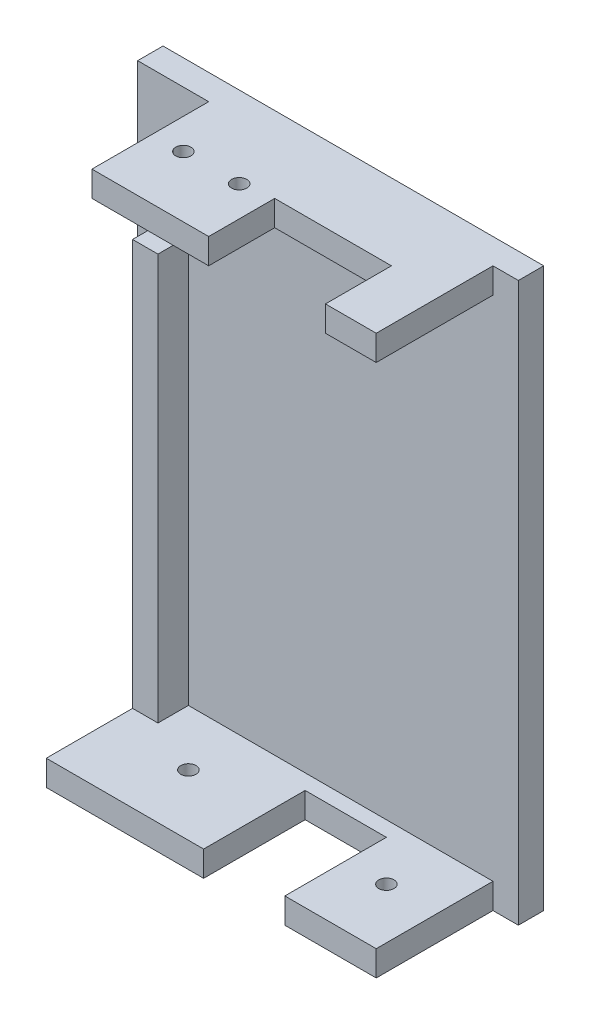
ISO-10303-21;
HEADER;
FILE_DESCRIPTION(('STEP AP214'),'2;1');
FILE_NAME('part.step','',(''),(''),'','','');
FILE_SCHEMA(('AUTOMOTIVE_DESIGN { 1 0 10303 214 1 1 1 1 }'));
ENDSEC;
DATA;
#1=APPLICATION_CONTEXT('core data for automotive mechanical design processes');
#2=APPLICATION_PROTOCOL_DEFINITION('international standard','automotive_design',2000,#1);
#3=PRODUCT_CONTEXT('',#1,'mechanical');
#4=PRODUCT('Part','Part','',(#3));
#5=PRODUCT_RELATED_PRODUCT_CATEGORY('part','',(#4));
#6=PRODUCT_DEFINITION_FORMATION('','',#4);
#7=PRODUCT_DEFINITION_CONTEXT('part definition',#1,'design');
#8=PRODUCT_DEFINITION('design','',#6,#7);
#9=PRODUCT_DEFINITION_SHAPE('','',#8);
#10=(LENGTH_UNIT() NAMED_UNIT(*) SI_UNIT(.MILLI.,.METRE.));
#11=(NAMED_UNIT(*) PLANE_ANGLE_UNIT() SI_UNIT($,.RADIAN.));
#12=(NAMED_UNIT(*) SI_UNIT($,.STERADIAN.) SOLID_ANGLE_UNIT());
#13=UNCERTAINTY_MEASURE_WITH_UNIT(LENGTH_MEASURE(1.E-05),#10,'distance_accuracy_value','');
#14=(GEOMETRIC_REPRESENTATION_CONTEXT(3) GLOBAL_UNCERTAINTY_ASSIGNED_CONTEXT((#13)) GLOBAL_UNIT_ASSIGNED_CONTEXT((#10,
#11,#12)) REPRESENTATION_CONTEXT('',''));
#15=CARTESIAN_POINT('',(0.,0.,0.));
#16=DIRECTION('',(0.,0.,1.));
#17=DIRECTION('',(1.,0.,0.));
#18=AXIS2_PLACEMENT_3D('',#15,#16,#17);
#19=CARTESIAN_POINT('',(0.,0.,5.));
#20=DIRECTION('',(0.,0.,1.));
#21=DIRECTION('',(1.,0.,0.));
#22=AXIS2_PLACEMENT_3D('',#19,#20,#21);
#23=PLANE('',#22);
#24=DIRECTION('',(0.,-1.,0.));
#25=VECTOR('',#24,1.);
#26=CARTESIAN_POINT('',(-23.1443249343249,-74.6317663817664,5.));
#27=LINE('',#26,#25);
#28=CARTESIAN_POINT('',(-23.1443249343249,10.3682336182336,5.));
#29=VERTEX_POINT('',#28);
#30=CARTESIAN_POINT('',(-23.1443249343249,-74.6317663817664,5.));
#31=VERTEX_POINT('',#30);
#32=EDGE_CURVE('E53',#29,#31,#27,.T.);
#33=ORIENTED_EDGE('',*,*,#32,.F.);
#34=DIRECTION('',(-1.,0.,0.));
#35=VECTOR('',#34,1.);
#36=CARTESIAN_POINT('',(-23.1443249343249,10.3682336182336,5.));
#37=LINE('',#36,#35);
#38=CARTESIAN_POINT('',(-18.1443249343249,10.3682336182336,5.));
#39=VERTEX_POINT('',#38);
#40=EDGE_CURVE('E48',#39,#29,#37,.T.);
#41=ORIENTED_EDGE('',*,*,#40,.F.);
#42=DIRECTION('',(0.,1.,0.));
#43=VECTOR('',#42,1.);
#44=CARTESIAN_POINT('',(-18.1443249343249,-69.6317663817664,5.));
#45=LINE('',#44,#43);
#46=CARTESIAN_POINT('',(-18.1443249343249,-69.6317663817664,5.));
#47=VERTEX_POINT('',#46);
#48=EDGE_CURVE('E216',#47,#39,#45,.T.);
#49=ORIENTED_EDGE('',*,*,#48,.F.);
#50=DIRECTION('',(-1.,0.,0.));
#51=VECTOR('',#50,1.);
#52=CARTESIAN_POINT('',(-23.1443249343249,-69.6317663817664,5.));
#53=LINE('',#52,#51);
#54=CARTESIAN_POINT('',(41.8556750656751,-69.6317663817664,5.));
#55=VERTEX_POINT('',#54);
#56=EDGE_CURVE('E193',#55,#47,#53,.T.);
#57=ORIENTED_EDGE('',*,*,#56,.F.);
#58=DIRECTION('',(0.,1.,0.));
#59=VECTOR('',#58,1.);
#60=CARTESIAN_POINT('',(41.8556750656751,-74.6317663817664,5.));
#61=LINE('',#60,#59);
#62=CARTESIAN_POINT('',(41.8556750656751,-74.6317663817664,5.));
#63=VERTEX_POINT('',#62);
#64=EDGE_CURVE('E337',#63,#55,#61,.T.);
#65=ORIENTED_EDGE('',*,*,#64,.F.);
#66=DIRECTION('',(1.,0.,0.));
#67=VECTOR('',#66,1.);
#68=CARTESIAN_POINT('',(-28.1443249343249,-74.6317663817664,5.));
#69=LINE('',#68,#67);
#70=CARTESIAN_POINT('',(46.8556750656751,-74.6317663817664,5.));
#71=VERTEX_POINT('',#70);
#72=EDGE_CURVE('E416',#63,#71,#69,.T.);
#73=ORIENTED_EDGE('',*,*,#72,.T.);
#74=DIRECTION('',(0.,1.,0.));
#75=VECTOR('',#74,1.);
#76=CARTESIAN_POINT('',(46.8556750656751,35.3682336182336,5.));
#77=LINE('',#76,#75);
#78=CARTESIAN_POINT('',(46.8556750656751,35.3682336182336,5.));
#79=VERTEX_POINT('',#78);
#80=EDGE_CURVE('E386',#71,#79,#77,.T.);
#81=ORIENTED_EDGE('',*,*,#80,.T.);
#82=DIRECTION('',(-1.,0.,0.));
#83=VECTOR('',#82,1.);
#84=CARTESIAN_POINT('',(-28.1443249343249,35.3682336182336,5.));
#85=LINE('',#84,#83);
#86=CARTESIAN_POINT('',(41.8556750656751,35.3682336182336,5.));
#87=VERTEX_POINT('',#86);
#88=EDGE_CURVE('E384',#79,#87,#85,.T.);
#89=ORIENTED_EDGE('',*,*,#88,.T.);
#90=DIRECTION('',(0.,1.,0.));
#91=VECTOR('',#90,1.);
#92=CARTESIAN_POINT('',(41.8556750656751,30.3682336182336,5.));
#93=LINE('',#92,#91);
#94=CARTESIAN_POINT('',(41.8556750656751,30.3682336182336,5.));
#95=VERTEX_POINT('',#94);
#96=EDGE_CURVE('E287',#95,#87,#93,.T.);
#97=ORIENTED_EDGE('',*,*,#96,.F.);
#98=DIRECTION('',(1.,0.,0.));
#99=VECTOR('',#98,1.);
#100=CARTESIAN_POINT('',(-14.1443249343249,30.3682336182336,5.));
#101=LINE('',#100,#99);
#102=CARTESIAN_POINT('',(-14.1443249343249,30.3682336182336,5.));
#103=VERTEX_POINT('',#102);
#104=EDGE_CURVE('E301',#103,#95,#101,.T.);
#105=ORIENTED_EDGE('',*,*,#104,.F.);
#106=DIRECTION('',(0.,-1.,0.));
#107=VECTOR('',#106,1.);
#108=CARTESIAN_POINT('',(-14.1443249343249,30.3682336182336,5.));
#109=LINE('',#108,#107);
#110=CARTESIAN_POINT('',(-14.1443249343249,35.3682336182336,5.));
#111=VERTEX_POINT('',#110);
#112=EDGE_CURVE('E298',#111,#103,#109,.T.);
#113=ORIENTED_EDGE('',*,*,#112,.F.);
#114=CARTESIAN_POINT('',(-28.1443249343249,35.3682336182336,5.));
#115=VERTEX_POINT('',#114);
#116=EDGE_CURVE('E382',#111,#115,#85,.T.);
#117=ORIENTED_EDGE('',*,*,#116,.T.);
#118=DIRECTION('',(0.,-1.,0.));
#119=VECTOR('',#118,1.);
#120=CARTESIAN_POINT('',(-28.1443249343249,35.3682336182336,5.));
#121=LINE('',#120,#119);
#122=CARTESIAN_POINT('',(-28.1443249343249,-74.6317663817664,5.));
#123=VERTEX_POINT('',#122);
#124=EDGE_CURVE('E406',#115,#123,#121,.T.);
#125=ORIENTED_EDGE('',*,*,#124,.T.);
#126=EDGE_CURVE('E414',#123,#31,#69,.T.);
#127=ORIENTED_EDGE('',*,*,#126,.T.);
#128=EDGE_LOOP('',(#33,#41,#49,#57,#65,#73,#81,#89,#97,#105,#113,#117,#125,#127));
#129=FACE_BOUND('',#128,.T.);
#130=ADVANCED_FACE('F32',(#129),#23,.T.);
#131=CARTESIAN_POINT('',(-23.1443249343249,-69.6317663817664,28.));
#132=DIRECTION('',(0.,-1.,0.));
#133=DIRECTION('',(0.,0.,-1.));
#134=AXIS2_PLACEMENT_3D('',#131,#132,#133);
#135=PLANE('',#134);
#136=CARTESIAN_POINT('',(31.8556750656751,-69.6317663817664,16.));
#137=DIRECTION('',(0.,1.,0.));
#138=DIRECTION('',(0.,0.,1.));
#139=AXIS2_PLACEMENT_3D('',#136,#137,#138);
#140=CIRCLE('',#139,1.5);
#141=CARTESIAN_POINT('',(31.8556750656751,-69.6317663817664,17.5));
#142=VERTEX_POINT('',#141);
#143=EDGE_CURVE('E225',#142,#142,#140,.T.);
#144=ORIENTED_EDGE('',*,*,#143,.F.);
#145=EDGE_LOOP('',(#144));
#146=FACE_BOUND('',#145,.T.);
#147=CARTESIAN_POINT('',(-7.14432493432495,-69.6317663817664,16.));
#148=DIRECTION('',(0.,-1.,0.));
#149=DIRECTION('',(0.,0.,-1.));
#150=AXIS2_PLACEMENT_3D('',#147,#148,#149);
#151=CIRCLE('',#150,1.5);
#152=CARTESIAN_POINT('',(-7.14432493432495,-69.6317663817664,14.5));
#153=VERTEX_POINT('',#152);
#154=EDGE_CURVE('E222',#153,#153,#151,.F.);
#155=ORIENTED_EDGE('',*,*,#154,.F.);
#156=EDGE_LOOP('',(#155));
#157=FACE_BOUND('',#156,.T.);
#158=DIRECTION('',(0.,0.,-1.));
#159=VECTOR('',#158,1.);
#160=CARTESIAN_POINT('',(-18.1443249343249,-69.6317663817664,11.));
#161=LINE('',#160,#159);
#162=CARTESIAN_POINT('',(-18.1443249343249,-69.6317663817664,11.));
#163=VERTEX_POINT('',#162);
#164=EDGE_CURVE('E186',#163,#47,#161,.T.);
#165=ORIENTED_EDGE('',*,*,#164,.F.);
#166=DIRECTION('',(1.,0.,0.));
#167=VECTOR('',#166,1.);
#168=CARTESIAN_POINT('',(-23.1443249343249,-69.6317663817664,11.));
#169=LINE('',#168,#167);
#170=CARTESIAN_POINT('',(-23.1443249343249,-69.6317663817664,11.));
#171=VERTEX_POINT('',#170);
#172=EDGE_CURVE('E190',#171,#163,#169,.T.);
#173=ORIENTED_EDGE('',*,*,#172,.F.);
#174=DIRECTION('',(0.,0.,-1.));
#175=VECTOR('',#174,1.);
#176=CARTESIAN_POINT('',(-23.1443249343249,-69.6317663817664,28.));
#177=LINE('',#176,#175);
#178=CARTESIAN_POINT('',(-23.1443249343249,-69.6317663817664,28.));
#179=VERTEX_POINT('',#178);
#180=EDGE_CURVE('E330',#179,#171,#177,.T.);
#181=ORIENTED_EDGE('',*,*,#180,.F.);
#182=DIRECTION('',(-1.,0.,0.));
#183=VECTOR('',#182,1.);
#184=CARTESIAN_POINT('',(-23.1443249343249,-69.6317663817664,28.));
#185=LINE('',#184,#183);
#186=CARTESIAN_POINT('',(7.85567506567506,-69.6317663817664,28.));
#187=VERTEX_POINT('',#186);
#188=EDGE_CURVE('E326',#187,#179,#185,.T.);
#189=ORIENTED_EDGE('',*,*,#188,.F.);
#190=DIRECTION('',(0.,0.,1.));
#191=VECTOR('',#190,1.);
#192=CARTESIAN_POINT('',(7.85567506567507,-69.6317663817664,28.));
#193=LINE('',#192,#191);
#194=CARTESIAN_POINT('',(7.85567506567506,-69.6317663817664,8.));
#195=VERTEX_POINT('',#194);
#196=EDGE_CURVE('E244',#195,#187,#193,.T.);
#197=ORIENTED_EDGE('',*,*,#196,.F.);
#198=DIRECTION('',(-1.,0.,0.));
#199=VECTOR('',#198,1.);
#200=CARTESIAN_POINT('',(23.8556750656751,-69.6317663817664,8.));
#201=LINE('',#200,#199);
#202=CARTESIAN_POINT('',(23.8556750656751,-69.6317663817664,8.));
#203=VERTEX_POINT('',#202);
#204=EDGE_CURVE('E241',#203,#195,#201,.T.);
#205=ORIENTED_EDGE('',*,*,#204,.F.);
#206=DIRECTION('',(0.,0.,-1.));
#207=VECTOR('',#206,1.);
#208=CARTESIAN_POINT('',(23.8556750656751,-69.6317663817664,28.));
#209=LINE('',#208,#207);
#210=CARTESIAN_POINT('',(23.8556750656751,-69.6317663817664,28.));
#211=VERTEX_POINT('',#210);
#212=EDGE_CURVE('E238',#211,#203,#209,.T.);
#213=ORIENTED_EDGE('',*,*,#212,.F.);
#214=CARTESIAN_POINT('',(41.8556750656751,-69.6317663817664,28.));
#215=VERTEX_POINT('',#214);
#216=EDGE_CURVE('E327',#215,#211,#185,.T.);
#217=ORIENTED_EDGE('',*,*,#216,.F.);
#218=DIRECTION('',(0.,0.,-1.));
#219=VECTOR('',#218,1.);
#220=CARTESIAN_POINT('',(41.8556750656751,-69.6317663817664,28.));
#221=LINE('',#220,#219);
#222=EDGE_CURVE('E422',#215,#55,#221,.T.);
#223=ORIENTED_EDGE('',*,*,#222,.T.);
#224=ORIENTED_EDGE('',*,*,#56,.T.);
#225=EDGE_LOOP('',(#165,#173,#181,#189,#197,#205,#213,#217,#223,#224));
#226=FACE_BOUND('',#225,.T.);
#227=ADVANCED_FACE('F188',(#146,#157,#226),#135,.F.);
#228=CARTESIAN_POINT('',(0.,0.,28.));
#229=DIRECTION('',(0.,0.,-1.));
#230=DIRECTION('',(-1.,0.,0.));
#231=AXIS2_PLACEMENT_3D('',#228,#229,#230);
#232=PLANE('',#231);
#233=ORIENTED_EDGE('',*,*,#216,.T.);
#234=DIRECTION('',(0.,1.,0.));
#235=VECTOR('',#234,1.);
#236=CARTESIAN_POINT('',(23.8556750656751,-74.6328163817664,28.));
#237=LINE('',#236,#235);
#238=CARTESIAN_POINT('',(23.8556750656751,-74.6317663817664,28.));
#239=VERTEX_POINT('',#238);
#240=EDGE_CURVE('E247',#239,#211,#237,.T.);
#241=ORIENTED_EDGE('',*,*,#240,.F.);
#242=DIRECTION('',(1.,0.,0.));
#243=VECTOR('',#242,1.);
#244=CARTESIAN_POINT('',(-23.1443249343249,-74.6317663817664,28.));
#245=LINE('',#244,#243);
#246=CARTESIAN_POINT('',(41.8556750656751,-74.6317663817664,28.));
#247=VERTEX_POINT('',#246);
#248=EDGE_CURVE('E320',#239,#247,#245,.T.);
#249=ORIENTED_EDGE('',*,*,#248,.T.);
#250=DIRECTION('',(0.,1.,0.));
#251=VECTOR('',#250,1.);
#252=CARTESIAN_POINT('',(41.8556750656751,-74.6317663817664,28.));
#253=LINE('',#252,#251);
#254=EDGE_CURVE('E324',#247,#215,#253,.T.);
#255=ORIENTED_EDGE('',*,*,#254,.T.);
#256=EDGE_LOOP('',(#233,#241,#249,#255));
#257=FACE_BOUND('',#256,.T.);
#258=ADVANCED_FACE('F449',(#257),#232,.F.);
#259=CARTESIAN_POINT('',(0.,0.,28.));
#260=DIRECTION('',(0.,0.,-1.));
#261=DIRECTION('',(-1.,0.,0.));
#262=AXIS2_PLACEMENT_3D('',#259,#260,#261);
#263=PLANE('',#262);
#264=DIRECTION('',(-1.,0.,0.));
#265=VECTOR('',#264,1.);
#266=CARTESIAN_POINT('',(-14.1443249343249,35.3682336182336,28.));
#267=LINE('',#266,#265);
#268=CARTESIAN_POINT('',(41.8556750656751,35.3682336182336,28.));
#269=VERTEX_POINT('',#268);
#270=CARTESIAN_POINT('',(31.8556750656751,35.3682336182336,28.));
#271=VERTEX_POINT('',#270);
#272=EDGE_CURVE('E294',#269,#271,#267,.T.);
#273=ORIENTED_EDGE('',*,*,#272,.T.);
#274=DIRECTION('',(0.,-1.,0.));
#275=VECTOR('',#274,1.);
#276=CARTESIAN_POINT('',(31.8556750656751,0.,28.));
#277=LINE('',#276,#275);
#278=CARTESIAN_POINT('',(31.8556750656751,30.3682336182336,28.));
#279=VERTEX_POINT('',#278);
#280=EDGE_CURVE('E41',#271,#279,#277,.T.);
#281=ORIENTED_EDGE('',*,*,#280,.T.);
#282=DIRECTION('',(1.,0.,0.));
#283=VECTOR('',#282,1.);
#284=CARTESIAN_POINT('',(-14.1443249343249,30.3682336182336,28.));
#285=LINE('',#284,#283);
#286=CARTESIAN_POINT('',(41.8556750656751,30.3682336182336,28.));
#287=VERTEX_POINT('',#286);
#288=EDGE_CURVE('E286',#279,#287,#285,.T.);
#289=ORIENTED_EDGE('',*,*,#288,.T.);
#290=DIRECTION('',(0.,1.,0.));
#291=VECTOR('',#290,1.);
#292=CARTESIAN_POINT('',(41.8556750656751,30.3682336182336,28.));
#293=LINE('',#292,#291);
#294=EDGE_CURVE('E291',#287,#269,#293,.T.);
#295=ORIENTED_EDGE('',*,*,#294,.T.);
#296=EDGE_LOOP('',(#273,#281,#289,#295));
#297=FACE_BOUND('',#296,.T.);
#298=ADVANCED_FACE('F349',(#297),#263,.F.);
#299=CARTESIAN_POINT('',(-28.1443249343249,35.3682336182336,5.));
#300=DIRECTION('',(1.,0.,0.));
#301=DIRECTION('',(0.,1.,0.));
#302=AXIS2_PLACEMENT_3D('',#299,#300,#301);
#303=PLANE('',#302);
#304=DIRECTION('',(0.,-1.,0.));
#305=VECTOR('',#304,1.);
#306=CARTESIAN_POINT('',(-28.1443249343249,35.3682336182336,0.));
#307=LINE('',#306,#305);
#308=CARTESIAN_POINT('',(-28.1443249343249,35.3682336182336,0.));
#309=VERTEX_POINT('',#308);
#310=CARTESIAN_POINT('',(-28.1443249343249,-74.6317663817664,0.));
#311=VERTEX_POINT('',#310);
#312=EDGE_CURVE('E397',#309,#311,#307,.T.);
#313=ORIENTED_EDGE('',*,*,#312,.T.);
#314=DIRECTION('',(0.,0.,-1.));
#315=VECTOR('',#314,1.);
#316=CARTESIAN_POINT('',(-28.1443249343249,-74.6317663817664,5.));
#317=LINE('',#316,#315);
#318=EDGE_CURVE('E345',#123,#311,#317,.T.);
#319=ORIENTED_EDGE('',*,*,#318,.F.);
#320=ORIENTED_EDGE('',*,*,#124,.F.);
#321=DIRECTION('',(0.,0.,-1.));
#322=VECTOR('',#321,1.);
#323=CARTESIAN_POINT('',(-28.1443249343249,35.3682336182336,5.));
#324=LINE('',#323,#322);
#325=EDGE_CURVE('E389',#115,#309,#324,.T.);
#326=ORIENTED_EDGE('',*,*,#325,.T.);
#327=EDGE_LOOP('',(#313,#319,#320,#326));
#328=FACE_BOUND('',#327,.T.);
#329=ADVANCED_FACE('F34',(#328),#303,.F.);
#330=CARTESIAN_POINT('',(-28.1443249343249,-74.6317663817664,5.));
#331=DIRECTION('',(0.,1.,0.));
#332=DIRECTION('',(0.,0.,1.));
#333=AXIS2_PLACEMENT_3D('',#330,#331,#332);
#334=PLANE('',#333);
#335=CARTESIAN_POINT('',(-7.14432493432495,-74.6317663817664,16.));
#336=DIRECTION('',(0.,-1.,0.));
#337=DIRECTION('',(0.,0.,-1.));
#338=AXIS2_PLACEMENT_3D('',#335,#336,#337);
#339=CIRCLE('',#338,1.5);
#340=CARTESIAN_POINT('',(-7.14432493432495,-74.6317663817664,14.5));
#341=VERTEX_POINT('',#340);
#342=EDGE_CURVE('E196',#341,#341,#339,.T.);
#343=ORIENTED_EDGE('',*,*,#342,.F.);
#344=EDGE_LOOP('',(#343));
#345=FACE_BOUND('',#344,.T.);
#346=CARTESIAN_POINT('',(31.8556750656751,-74.6317663817664,16.));
#347=DIRECTION('',(0.,1.,0.));
#348=DIRECTION('',(0.,0.,1.));
#349=AXIS2_PLACEMENT_3D('',#346,#347,#348);
#350=CIRCLE('',#349,1.5);
#351=CARTESIAN_POINT('',(31.8556750656751,-74.6317663817664,17.5));
#352=VERTEX_POINT('',#351);
#353=EDGE_CURVE('E230',#352,#352,#350,.F.);
#354=ORIENTED_EDGE('',*,*,#353,.F.);
#355=EDGE_LOOP('',(#354));
#356=FACE_BOUND('',#355,.T.);
#357=ORIENTED_EDGE('',*,*,#248,.F.);
#358=DIRECTION('',(0.,0.,1.));
#359=VECTOR('',#358,1.);
#360=CARTESIAN_POINT('',(23.8556750656751,-74.6317663817664,28.));
#361=LINE('',#360,#359);
#362=CARTESIAN_POINT('',(23.8556750656751,-74.6317663817664,8.));
#363=VERTEX_POINT('',#362);
#364=EDGE_CURVE('E236',#363,#239,#361,.T.);
#365=ORIENTED_EDGE('',*,*,#364,.F.);
#366=DIRECTION('',(1.,0.,0.));
#367=VECTOR('',#366,1.);
#368=CARTESIAN_POINT('',(23.8556750656751,-74.6317663817664,8.));
#369=LINE('',#368,#367);
#370=CARTESIAN_POINT('',(7.85567506567506,-74.6317663817664,8.));
#371=VERTEX_POINT('',#370);
#372=EDGE_CURVE('E249',#371,#363,#369,.T.);
#373=ORIENTED_EDGE('',*,*,#372,.F.);
#374=DIRECTION('',(0.,0.,-1.));
#375=VECTOR('',#374,1.);
#376=CARTESIAN_POINT('',(7.85567506567507,-74.6317663817664,28.));
#377=LINE('',#376,#375);
#378=CARTESIAN_POINT('',(7.85567506567507,-74.6317663817664,28.));
#379=VERTEX_POINT('',#378);
#380=EDGE_CURVE('E233',#379,#371,#377,.T.);
#381=ORIENTED_EDGE('',*,*,#380,.F.);
#382=CARTESIAN_POINT('',(-23.1443249343249,-74.6317663817664,28.));
#383=VERTEX_POINT('',#382);
#384=EDGE_CURVE('E321',#383,#379,#245,.T.);
#385=ORIENTED_EDGE('',*,*,#384,.F.);
#386=DIRECTION('',(0.,0.,-1.));
#387=VECTOR('',#386,1.);
#388=CARTESIAN_POINT('',(-23.1443249343249,-74.6317663817664,28.));
#389=LINE('',#388,#387);
#390=EDGE_CURVE('E401',#383,#31,#389,.T.);
#391=ORIENTED_EDGE('',*,*,#390,.T.);
#392=ORIENTED_EDGE('',*,*,#126,.F.);
#393=ORIENTED_EDGE('',*,*,#318,.T.);
#394=DIRECTION('',(1.,0.,0.));
#395=VECTOR('',#394,1.);
#396=CARTESIAN_POINT('',(-28.1443249343249,-74.6317663817664,0.));
#397=LINE('',#396,#395);
#398=CARTESIAN_POINT('',(46.8556750656751,-74.6317663817664,0.));
#399=VERTEX_POINT('',#398);
#400=EDGE_CURVE('E400',#311,#399,#397,.T.);
#401=ORIENTED_EDGE('',*,*,#400,.T.);
#402=DIRECTION('',(0.,0.,-1.));
#403=VECTOR('',#402,1.);
#404=CARTESIAN_POINT('',(46.8556750656751,-74.6317663817664,5.));
#405=LINE('',#404,#403);
#406=EDGE_CURVE('E409',#71,#399,#405,.T.);
#407=ORIENTED_EDGE('',*,*,#406,.F.);
#408=ORIENTED_EDGE('',*,*,#72,.F.);
#409=DIRECTION('',(0.,0.,-1.));
#410=VECTOR('',#409,1.);
#411=CARTESIAN_POINT('',(41.8556750656751,-74.6317663817664,28.));
#412=LINE('',#411,#410);
#413=EDGE_CURVE('E423',#247,#63,#412,.T.);
#414=ORIENTED_EDGE('',*,*,#413,.F.);
#415=EDGE_LOOP('',(#357,#365,#373,#381,#385,#391,#392,#393,#401,#407,#408,#414));
#416=FACE_BOUND('',#415,.T.);
#417=ADVANCED_FACE('F439',(#345,#356,#416),#334,.F.);
#418=CARTESIAN_POINT('',(46.8556750656751,35.3682336182336,5.));
#419=DIRECTION('',(-1.,0.,0.));
#420=DIRECTION('',(0.,-1.,0.));
#421=AXIS2_PLACEMENT_3D('',#418,#419,#420);
#422=PLANE('',#421);
#423=DIRECTION('',(0.,1.,0.));
#424=VECTOR('',#423,1.);
#425=CARTESIAN_POINT('',(46.8556750656751,35.3682336182336,0.));
#426=LINE('',#425,#424);
#427=CARTESIAN_POINT('',(46.8556750656751,35.3682336182336,0.));
#428=VERTEX_POINT('',#427);
#429=EDGE_CURVE('E403',#399,#428,#426,.T.);
#430=ORIENTED_EDGE('',*,*,#429,.T.);
#431=DIRECTION('',(0.,0.,-1.));
#432=VECTOR('',#431,1.);
#433=CARTESIAN_POINT('',(46.8556750656751,35.3682336182336,5.));
#434=LINE('',#433,#432);
#435=EDGE_CURVE('E392',#79,#428,#434,.T.);
#436=ORIENTED_EDGE('',*,*,#435,.F.);
#437=ORIENTED_EDGE('',*,*,#80,.F.);
#438=ORIENTED_EDGE('',*,*,#406,.T.);
#439=EDGE_LOOP('',(#430,#436,#437,#438));
#440=FACE_BOUND('',#439,.T.);
#441=ADVANCED_FACE('F491',(#440),#422,.F.);
#442=CARTESIAN_POINT('',(-28.1443249343249,35.3682336182336,5.));
#443=DIRECTION('',(0.,-1.,0.));
#444=DIRECTION('',(0.,0.,-1.));
#445=AXIS2_PLACEMENT_3D('',#442,#443,#444);
#446=PLANE('',#445);
#447=CARTESIAN_POINT('',(-8.14432493432493,35.3682336182336,16.));
#448=DIRECTION('',(0.,1.,0.));
#449=DIRECTION('',(0.,0.,1.));
#450=AXIS2_PLACEMENT_3D('',#447,#448,#449);
#451=CIRCLE('',#450,1.5);
#452=CARTESIAN_POINT('',(-8.14432493432493,35.3682336182336,17.5));
#453=VERTEX_POINT('',#452);
#454=EDGE_CURVE('E258',#453,#453,#451,.T.);
#455=ORIENTED_EDGE('',*,*,#454,.F.);
#456=EDGE_LOOP('',(#455));
#457=FACE_BOUND('',#456,.T.);
#458=CARTESIAN_POINT('',(2.85567506567507,35.3682336182336,16.));
#459=DIRECTION('',(0.,1.,0.));
#460=DIRECTION('',(0.,0.,1.));
#461=AXIS2_PLACEMENT_3D('',#458,#459,#460);
#462=CIRCLE('',#461,1.5);
#463=CARTESIAN_POINT('',(2.85567506567507,35.3682336182336,17.5));
#464=VERTEX_POINT('',#463);
#465=EDGE_CURVE('E279',#464,#464,#462,.T.);
#466=ORIENTED_EDGE('',*,*,#465,.F.);
#467=EDGE_LOOP('',(#466));
#468=FACE_BOUND('',#467,.T.);
#469=DIRECTION('',(-1.,0.,0.));
#470=VECTOR('',#469,1.);
#471=CARTESIAN_POINT('',(31.8556750656751,35.3682336182336,15.));
#472=LINE('',#471,#470);
#473=CARTESIAN_POINT('',(31.8556750656751,35.3682336182336,15.));
#474=VERTEX_POINT('',#473);
#475=CARTESIAN_POINT('',(8.85567506567506,35.3682336182336,15.));
#476=VERTEX_POINT('',#475);
#477=EDGE_CURVE('E264',#474,#476,#472,.T.);
#478=ORIENTED_EDGE('',*,*,#477,.F.);
#479=DIRECTION('',(0.,0.,-1.));
#480=VECTOR('',#479,1.);
#481=CARTESIAN_POINT('',(31.8556750656751,35.3682336182336,28.));
#482=LINE('',#481,#480);
#483=EDGE_CURVE('E261',#271,#474,#482,.T.);
#484=ORIENTED_EDGE('',*,*,#483,.F.);
#485=ORIENTED_EDGE('',*,*,#272,.F.);
#486=DIRECTION('',(0.,0.,-1.));
#487=VECTOR('',#486,1.);
#488=CARTESIAN_POINT('',(41.8556750656751,35.3682336182336,28.));
#489=LINE('',#488,#487);
#490=EDGE_CURVE('E308',#269,#87,#489,.T.);
#491=ORIENTED_EDGE('',*,*,#490,.T.);
#492=ORIENTED_EDGE('',*,*,#88,.F.);
#493=ORIENTED_EDGE('',*,*,#435,.T.);
#494=DIRECTION('',(-1.,0.,0.));
#495=VECTOR('',#494,1.);
#496=CARTESIAN_POINT('',(-28.1443249343249,35.3682336182336,0.));
#497=LINE('',#496,#495);
#498=EDGE_CURVE('E405',#428,#309,#497,.T.);
#499=ORIENTED_EDGE('',*,*,#498,.T.);
#500=ORIENTED_EDGE('',*,*,#325,.F.);
#501=ORIENTED_EDGE('',*,*,#116,.F.);
#502=DIRECTION('',(0.,0.,-1.));
#503=VECTOR('',#502,1.);
#504=CARTESIAN_POINT('',(-14.1443249343249,35.3682336182336,28.));
#505=LINE('',#504,#503);
#506=CARTESIAN_POINT('',(-14.1443249343249,35.3682336182336,28.));
#507=VERTEX_POINT('',#506);
#508=EDGE_CURVE('E297',#507,#111,#505,.T.);
#509=ORIENTED_EDGE('',*,*,#508,.F.);
#510=CARTESIAN_POINT('',(8.85567506567505,35.3682336182336,28.));
#511=VERTEX_POINT('',#510);
#512=EDGE_CURVE('E293',#511,#507,#267,.T.);
#513=ORIENTED_EDGE('',*,*,#512,.F.);
#514=DIRECTION('',(0.,0.,1.));
#515=VECTOR('',#514,1.);
#516=CARTESIAN_POINT('',(8.85567506567507,35.3682336182336,28.));
#517=LINE('',#516,#515);
#518=EDGE_CURVE('E267',#476,#511,#517,.T.);
#519=ORIENTED_EDGE('',*,*,#518,.F.);
#520=EDGE_LOOP('',(#478,#484,#485,#491,#492,#493,#499,#500,#501,#509,#513,#519));
#521=FACE_BOUND('',#520,.T.);
#522=ADVANCED_FACE('F364',(#457,#468,#521),#446,.F.);
#523=CARTESIAN_POINT('',(0.,0.,0.));
#524=DIRECTION('',(0.,0.,1.));
#525=DIRECTION('',(1.,0.,0.));
#526=AXIS2_PLACEMENT_3D('',#523,#524,#525);
#527=PLANE('',#526);
#528=ORIENTED_EDGE('',*,*,#312,.F.);
#529=ORIENTED_EDGE('',*,*,#498,.F.);
#530=ORIENTED_EDGE('',*,*,#429,.F.);
#531=ORIENTED_EDGE('',*,*,#400,.F.);
#532=EDGE_LOOP('',(#528,#529,#530,#531));
#533=FACE_BOUND('',#532,.T.);
#534=ADVANCED_FACE('F485',(#533),#527,.F.);
#535=CARTESIAN_POINT('',(-23.1443249343249,-74.6317663817664,28.));
#536=DIRECTION('',(1.,0.,0.));
#537=DIRECTION('',(0.,0.,-1.));
#538=AXIS2_PLACEMENT_3D('',#535,#536,#537);
#539=PLANE('',#538);
#540=ORIENTED_EDGE('',*,*,#32,.T.);
#541=ORIENTED_EDGE('',*,*,#390,.F.);
#542=DIRECTION('',(0.,-1.,0.));
#543=VECTOR('',#542,1.);
#544=CARTESIAN_POINT('',(-23.1443249343249,-74.6317663817664,28.));
#545=LINE('',#544,#543);
#546=EDGE_CURVE('E317',#179,#383,#545,.T.);
#547=ORIENTED_EDGE('',*,*,#546,.F.);
#548=ORIENTED_EDGE('',*,*,#180,.T.);
#549=DIRECTION('',(0.,-1.,0.));
#550=VECTOR('',#549,1.);
#551=CARTESIAN_POINT('',(-23.1443249343249,-69.6317663817664,11.));
#552=LINE('',#551,#550);
#553=CARTESIAN_POINT('',(-23.1443249343249,10.3682336182336,11.));
#554=VERTEX_POINT('',#553);
#555=EDGE_CURVE('E205',#554,#171,#552,.T.);
#556=ORIENTED_EDGE('',*,*,#555,.F.);
#557=DIRECTION('',(0.,0.,-1.));
#558=VECTOR('',#557,1.);
#559=CARTESIAN_POINT('',(-23.1443249343249,10.3682336182336,11.));
#560=LINE('',#559,#558);
#561=EDGE_CURVE('E212',#554,#29,#560,.T.);
#562=ORIENTED_EDGE('',*,*,#561,.T.);
#563=EDGE_LOOP('',(#540,#541,#547,#548,#556,#562));
#564=FACE_BOUND('',#563,.T.);
#565=ADVANCED_FACE('F426',(#564),#539,.F.);
#566=CARTESIAN_POINT('',(41.8556750656751,-74.6317663817664,28.));
#567=DIRECTION('',(-1.,0.,0.));
#568=DIRECTION('',(0.,0.,1.));
#569=AXIS2_PLACEMENT_3D('',#566,#567,#568);
#570=PLANE('',#569);
#571=ORIENTED_EDGE('',*,*,#64,.T.);
#572=ORIENTED_EDGE('',*,*,#222,.F.);
#573=ORIENTED_EDGE('',*,*,#254,.F.);
#574=ORIENTED_EDGE('',*,*,#413,.T.);
#575=EDGE_LOOP('',(#571,#572,#573,#574));
#576=FACE_BOUND('',#575,.T.);
#577=ADVANCED_FACE('F456',(#576),#570,.F.);
#578=ORIENTED_EDGE('',*,*,#384,.T.);
#579=DIRECTION('',(0.,1.,0.));
#580=VECTOR('',#579,1.);
#581=CARTESIAN_POINT('',(7.85567506567507,-74.6328163817664,28.));
#582=LINE('',#581,#580);
#583=EDGE_CURVE('E250',#379,#187,#582,.T.);
#584=ORIENTED_EDGE('',*,*,#583,.T.);
#585=ORIENTED_EDGE('',*,*,#188,.T.);
#586=ORIENTED_EDGE('',*,*,#546,.T.);
#587=EDGE_LOOP('',(#578,#584,#585,#586));
#588=FACE_BOUND('',#587,.T.);
#589=ADVANCED_FACE('F432',(#588),#232,.F.);
#590=CARTESIAN_POINT('',(-14.1443249343249,30.3682336182336,28.));
#591=DIRECTION('',(1.,0.,0.));
#592=DIRECTION('',(0.,0.,-1.));
#593=AXIS2_PLACEMENT_3D('',#590,#591,#592);
#594=PLANE('',#593);
#595=ORIENTED_EDGE('',*,*,#112,.T.);
#596=DIRECTION('',(0.,0.,-1.));
#597=VECTOR('',#596,1.);
#598=CARTESIAN_POINT('',(-14.1443249343249,30.3682336182336,28.));
#599=LINE('',#598,#597);
#600=CARTESIAN_POINT('',(-14.1443249343249,30.3682336182336,28.));
#601=VERTEX_POINT('',#600);
#602=EDGE_CURVE('E314',#601,#103,#599,.T.);
#603=ORIENTED_EDGE('',*,*,#602,.F.);
#604=DIRECTION('',(0.,-1.,0.));
#605=VECTOR('',#604,1.);
#606=CARTESIAN_POINT('',(-14.1443249343249,30.3682336182336,28.));
#607=LINE('',#606,#605);
#608=EDGE_CURVE('E283',#507,#601,#607,.T.);
#609=ORIENTED_EDGE('',*,*,#608,.F.);
#610=ORIENTED_EDGE('',*,*,#508,.T.);
#611=EDGE_LOOP('',(#595,#603,#609,#610));
#612=FACE_BOUND('',#611,.T.);
#613=ADVANCED_FACE('F379',(#612),#594,.F.);
#614=CARTESIAN_POINT('',(-14.1443249343249,30.3682336182336,28.));
#615=DIRECTION('',(0.,1.,0.));
#616=DIRECTION('',(0.,0.,1.));
#617=AXIS2_PLACEMENT_3D('',#614,#615,#616);
#618=PLANE('',#617);
#619=CARTESIAN_POINT('',(-8.14432493432493,30.3682336182336,16.));
#620=DIRECTION('',(0.,1.,0.));
#621=DIRECTION('',(0.,0.,1.));
#622=AXIS2_PLACEMENT_3D('',#619,#620,#621);
#623=CIRCLE('',#622,1.5);
#624=CARTESIAN_POINT('',(-8.14432493432493,30.3682336182336,17.5));
#625=VERTEX_POINT('',#624);
#626=EDGE_CURVE('E36',#625,#625,#623,.T.);
#627=ORIENTED_EDGE('',*,*,#626,.T.);
#628=EDGE_LOOP('',(#627));
#629=FACE_BOUND('',#628,.T.);
#630=ORIENTED_EDGE('',*,*,#288,.F.);
#631=DIRECTION('',(0.,0.,-1.));
#632=VECTOR('',#631,1.);
#633=CARTESIAN_POINT('',(31.8556750656751,30.3682336182336,28.));
#634=LINE('',#633,#632);
#635=CARTESIAN_POINT('',(31.8556750656751,30.3682336182336,15.));
#636=VERTEX_POINT('',#635);
#637=EDGE_CURVE('E276',#279,#636,#634,.T.);
#638=ORIENTED_EDGE('',*,*,#637,.T.);
#639=DIRECTION('',(-1.,0.,0.));
#640=VECTOR('',#639,1.);
#641=CARTESIAN_POINT('',(-14.1443249343249,30.3682336182336,15.));
#642=LINE('',#641,#640);
#643=CARTESIAN_POINT('',(8.85567506567506,30.3682336182336,15.));
#644=VERTEX_POINT('',#643);
#645=EDGE_CURVE('E11',#636,#644,#642,.T.);
#646=ORIENTED_EDGE('',*,*,#645,.T.);
#647=DIRECTION('',(0.,0.,1.));
#648=VECTOR('',#647,1.);
#649=CARTESIAN_POINT('',(8.85567506567507,30.3682336182336,28.));
#650=LINE('',#649,#648);
#651=CARTESIAN_POINT('',(8.85567506567507,30.3682336182336,28.));
#652=VERTEX_POINT('',#651);
#653=EDGE_CURVE('E272',#644,#652,#650,.T.);
#654=ORIENTED_EDGE('',*,*,#653,.T.);
#655=EDGE_CURVE('E288',#601,#652,#285,.T.);
#656=ORIENTED_EDGE('',*,*,#655,.F.);
#657=ORIENTED_EDGE('',*,*,#602,.T.);
#658=ORIENTED_EDGE('',*,*,#104,.T.);
#659=DIRECTION('',(0.,0.,-1.));
#660=VECTOR('',#659,1.);
#661=CARTESIAN_POINT('',(41.8556750656751,30.3682336182336,28.));
#662=LINE('',#661,#660);
#663=EDGE_CURVE('E311',#287,#95,#662,.T.);
#664=ORIENTED_EDGE('',*,*,#663,.F.);
#665=EDGE_LOOP('',(#630,#638,#646,#654,#656,#657,#658,#664));
#666=FACE_BOUND('',#665,.T.);
#667=CARTESIAN_POINT('',(2.85567506567507,30.3682336182336,16.));
#668=DIRECTION('',(0.,1.,0.));
#669=DIRECTION('',(0.,0.,1.));
#670=AXIS2_PLACEMENT_3D('',#667,#668,#669);
#671=CIRCLE('',#670,1.5);
#672=CARTESIAN_POINT('',(2.85567506567507,30.3682336182336,17.5));
#673=VERTEX_POINT('',#672);
#674=EDGE_CURVE('E282',#673,#673,#671,.T.);
#675=ORIENTED_EDGE('',*,*,#674,.T.);
#676=EDGE_LOOP('',(#675));
#677=FACE_BOUND('',#676,.T.);
#678=ADVANCED_FACE('F355',(#629,#666,#677),#618,.F.);
#679=CARTESIAN_POINT('',(41.8556750656751,30.3682336182336,28.));
#680=DIRECTION('',(-1.,0.,0.));
#681=DIRECTION('',(0.,-1.,0.));
#682=AXIS2_PLACEMENT_3D('',#679,#680,#681);
#683=PLANE('',#682);
#684=ORIENTED_EDGE('',*,*,#96,.T.);
#685=ORIENTED_EDGE('',*,*,#490,.F.);
#686=ORIENTED_EDGE('',*,*,#294,.F.);
#687=ORIENTED_EDGE('',*,*,#663,.T.);
#688=EDGE_LOOP('',(#684,#685,#686,#687));
#689=FACE_BOUND('',#688,.T.);
#690=ADVANCED_FACE('F360',(#689),#683,.F.);
#691=ORIENTED_EDGE('',*,*,#655,.T.);
#692=DIRECTION('',(0.,1.,0.));
#693=VECTOR('',#692,1.);
#694=CARTESIAN_POINT('',(8.85567506567507,0.,28.));
#695=LINE('',#694,#693);
#696=EDGE_CURVE('E342',#652,#511,#695,.T.);
#697=ORIENTED_EDGE('',*,*,#696,.T.);
#698=ORIENTED_EDGE('',*,*,#512,.T.);
#699=ORIENTED_EDGE('',*,*,#608,.T.);
#700=EDGE_LOOP('',(#691,#697,#698,#699));
#701=FACE_BOUND('',#700,.T.);
#702=ADVANCED_FACE('F373',(#701),#263,.F.);
#703=CARTESIAN_POINT('',(2.85567506567507,25.3682336182336,16.));
#704=DIRECTION('',(0.,1.,0.));
#705=DIRECTION('',(0.,0.,1.));
#706=AXIS2_PLACEMENT_3D('',#703,#704,#705);
#707=CYLINDRICAL_SURFACE('',#706,1.5);
#708=ORIENTED_EDGE('',*,*,#465,.T.);
#709=EDGE_LOOP('',(#708));
#710=FACE_BOUND('',#709,.T.);
#711=ORIENTED_EDGE('',*,*,#674,.F.);
#712=EDGE_LOOP('',(#711));
#713=FACE_BOUND('',#712,.T.);
#714=ADVANCED_FACE('F531',(#710,#713),#707,.F.);
#715=CARTESIAN_POINT('',(31.8556750656751,25.3682336182336,15.));
#716=DIRECTION('',(0.,0.,-1.));
#717=DIRECTION('',(-1.,0.,0.));
#718=AXIS2_PLACEMENT_3D('',#715,#716,#717);
#719=PLANE('',#718);
#720=DIRECTION('',(0.,1.,0.));
#721=VECTOR('',#720,1.);
#722=CARTESIAN_POINT('',(31.8556750656751,25.3682336182336,15.));
#723=LINE('',#722,#721);
#724=EDGE_CURVE('E269',#636,#474,#723,.T.);
#725=ORIENTED_EDGE('',*,*,#724,.T.);
#726=ORIENTED_EDGE('',*,*,#477,.T.);
#727=DIRECTION('',(0.,1.,0.));
#728=VECTOR('',#727,1.);
#729=CARTESIAN_POINT('',(8.85567506567506,25.3682336182336,15.));
#730=LINE('',#729,#728);
#731=EDGE_CURVE('E270',#644,#476,#730,.T.);
#732=ORIENTED_EDGE('',*,*,#731,.F.);
#733=ORIENTED_EDGE('',*,*,#645,.F.);
#734=EDGE_LOOP('',(#725,#726,#732,#733));
#735=FACE_BOUND('',#734,.T.);
#736=ADVANCED_FACE('F369',(#735),#719,.F.);
#737=CARTESIAN_POINT('',(31.8556750656751,25.3682336182336,28.));
#738=DIRECTION('',(1.,0.,0.));
#739=DIRECTION('',(0.,0.,-1.));
#740=AXIS2_PLACEMENT_3D('',#737,#738,#739);
#741=PLANE('',#740);
#742=ORIENTED_EDGE('',*,*,#280,.F.);
#743=ORIENTED_EDGE('',*,*,#483,.T.);
#744=ORIENTED_EDGE('',*,*,#724,.F.);
#745=ORIENTED_EDGE('',*,*,#637,.F.);
#746=EDGE_LOOP('',(#742,#743,#744,#745));
#747=FACE_BOUND('',#746,.T.);
#748=ADVANCED_FACE('F367',(#747),#741,.F.);
#749=CARTESIAN_POINT('',(8.85567506567507,25.3682336182336,28.));
#750=DIRECTION('',(-1.,0.,0.));
#751=DIRECTION('',(0.,0.,1.));
#752=AXIS2_PLACEMENT_3D('',#749,#750,#751);
#753=PLANE('',#752);
#754=ORIENTED_EDGE('',*,*,#731,.T.);
#755=ORIENTED_EDGE('',*,*,#518,.T.);
#756=ORIENTED_EDGE('',*,*,#696,.F.);
#757=ORIENTED_EDGE('',*,*,#653,.F.);
#758=EDGE_LOOP('',(#754,#755,#756,#757));
#759=FACE_BOUND('',#758,.T.);
#760=ADVANCED_FACE('F525',(#759),#753,.F.);
#761=CARTESIAN_POINT('',(-8.14432493432493,25.3682336182336,16.));
#762=DIRECTION('',(0.,1.,0.));
#763=DIRECTION('',(0.,0.,1.));
#764=AXIS2_PLACEMENT_3D('',#761,#762,#763);
#765=CYLINDRICAL_SURFACE('',#764,1.5);
#766=ORIENTED_EDGE('',*,*,#454,.T.);
#767=EDGE_LOOP('',(#766));
#768=FACE_BOUND('',#767,.T.);
#769=ORIENTED_EDGE('',*,*,#626,.F.);
#770=EDGE_LOOP('',(#769));
#771=FACE_BOUND('',#770,.T.);
#772=ADVANCED_FACE('F522',(#768,#771),#765,.F.);
#773=CARTESIAN_POINT('',(23.8556750656751,-74.6328163817664,28.));
#774=DIRECTION('',(1.,0.,0.));
#775=DIRECTION('',(0.,0.,-1.));
#776=AXIS2_PLACEMENT_3D('',#773,#774,#775);
#777=PLANE('',#776);
#778=ORIENTED_EDGE('',*,*,#364,.T.);
#779=ORIENTED_EDGE('',*,*,#240,.T.);
#780=ORIENTED_EDGE('',*,*,#212,.T.);
#781=DIRECTION('',(0.,1.,0.));
#782=VECTOR('',#781,1.);
#783=CARTESIAN_POINT('',(23.8556750656751,-74.6328163817664,8.));
#784=LINE('',#783,#782);
#785=EDGE_CURVE('E246',#363,#203,#784,.T.);
#786=ORIENTED_EDGE('',*,*,#785,.F.);
#787=EDGE_LOOP('',(#778,#779,#780,#786));
#788=FACE_BOUND('',#787,.T.);
#789=ADVANCED_FACE('F518',(#788),#777,.F.);
#790=CARTESIAN_POINT('',(7.85567506567507,-74.6328163817664,28.));
#791=DIRECTION('',(-1.,0.,0.));
#792=DIRECTION('',(0.,0.,1.));
#793=AXIS2_PLACEMENT_3D('',#790,#791,#792);
#794=PLANE('',#793);
#795=ORIENTED_EDGE('',*,*,#380,.T.);
#796=DIRECTION('',(0.,1.,0.));
#797=VECTOR('',#796,1.);
#798=CARTESIAN_POINT('',(7.85567506567506,-74.6328163817664,8.));
#799=LINE('',#798,#797);
#800=EDGE_CURVE('E253',#371,#195,#799,.T.);
#801=ORIENTED_EDGE('',*,*,#800,.T.);
#802=ORIENTED_EDGE('',*,*,#196,.T.);
#803=ORIENTED_EDGE('',*,*,#583,.F.);
#804=EDGE_LOOP('',(#795,#801,#802,#803));
#805=FACE_BOUND('',#804,.T.);
#806=ADVANCED_FACE('F435',(#805),#794,.F.);
#807=CARTESIAN_POINT('',(23.8556750656751,-74.6328163817664,8.));
#808=DIRECTION('',(0.,0.,-1.));
#809=DIRECTION('',(-1.,0.,0.));
#810=AXIS2_PLACEMENT_3D('',#807,#808,#809);
#811=PLANE('',#810);
#812=ORIENTED_EDGE('',*,*,#372,.T.);
#813=ORIENTED_EDGE('',*,*,#785,.T.);
#814=ORIENTED_EDGE('',*,*,#204,.T.);
#815=ORIENTED_EDGE('',*,*,#800,.F.);
#816=EDGE_LOOP('',(#812,#813,#814,#815));
#817=FACE_BOUND('',#816,.T.);
#818=ADVANCED_FACE('F443',(#817),#811,.F.);
#819=CARTESIAN_POINT('',(31.8556750656751,-74.6328163817664,16.));
#820=DIRECTION('',(0.,1.,0.));
#821=DIRECTION('',(0.,0.,1.));
#822=AXIS2_PLACEMENT_3D('',#819,#820,#821);
#823=CYLINDRICAL_SURFACE('',#822,1.5);
#824=CARTESIAN_POINT('',(31.8556750656751,-69.6317663817664,17.5));
#825=CARTESIAN_POINT('',(31.8556750656751,-69.6838497150997,17.5));
#826=CARTESIAN_POINT('',(31.8556750656751,-69.7359330484331,17.5));
#827=CARTESIAN_POINT('',(31.8556750656751,-69.8400997150997,17.5));
#828=CARTESIAN_POINT('',(31.8556750656751,-69.8921830484331,17.5));
#829=CARTESIAN_POINT('',(31.8556750656751,-69.9963497150997,17.5));
#830=CARTESIAN_POINT('',(31.8556750656751,-70.0484330484331,17.5));
#831=CARTESIAN_POINT('',(31.8556750656751,-70.1525997150997,17.5));
#832=CARTESIAN_POINT('',(31.8556750656751,-70.2046830484331,17.5));
#833=CARTESIAN_POINT('',(31.8556750656751,-70.3088497150997,17.5));
#834=CARTESIAN_POINT('',(31.8556750656751,-70.3609330484331,17.5));
#835=CARTESIAN_POINT('',(31.8556750656751,-70.4650997150997,17.5));
#836=CARTESIAN_POINT('',(31.8556750656751,-70.5171830484331,17.5));
#837=CARTESIAN_POINT('',(31.8556750656751,-70.6213497150997,17.5));
#838=CARTESIAN_POINT('',(31.8556750656751,-70.6734330484331,17.5));
#839=CARTESIAN_POINT('',(31.8556750656751,-70.7775997150997,17.5));
#840=CARTESIAN_POINT('',(31.8556750656751,-70.8296830484331,17.5));
#841=CARTESIAN_POINT('',(31.8556750656751,-70.9338497150997,17.5));
#842=CARTESIAN_POINT('',(31.8556750656751,-70.9859330484331,17.5));
#843=CARTESIAN_POINT('',(31.8556750656751,-71.0900997150997,17.5));
#844=CARTESIAN_POINT('',(31.8556750656751,-71.1421830484331,17.5));
#845=CARTESIAN_POINT('',(31.8556750656751,-71.2463497150997,17.5));
#846=CARTESIAN_POINT('',(31.8556750656751,-71.2984330484331,17.5));
#847=CARTESIAN_POINT('',(31.8556750656751,-71.4025997150997,17.5));
#848=CARTESIAN_POINT('',(31.8556750656751,-71.4546830484331,17.5));
#849=CARTESIAN_POINT('',(31.8556750656751,-71.5588497150997,17.5));
#850=CARTESIAN_POINT('',(31.8556750656751,-71.6109330484331,17.5));
#851=CARTESIAN_POINT('',(31.8556750656751,-71.7150997150997,17.5));
#852=CARTESIAN_POINT('',(31.8556750656751,-71.7671830484331,17.5));
#853=CARTESIAN_POINT('',(31.8556750656751,-71.8713497150997,17.5));
#854=CARTESIAN_POINT('',(31.8556750656751,-71.9234330484331,17.5));
#855=CARTESIAN_POINT('',(31.8556750656751,-72.0275997150997,17.5));
#856=CARTESIAN_POINT('',(31.8556750656751,-72.0796830484331,17.5));
#857=CARTESIAN_POINT('',(31.8556750656751,-72.1838497150997,17.5));
#858=CARTESIAN_POINT('',(31.8556750656751,-72.2359330484331,17.5));
#859=CARTESIAN_POINT('',(31.8556750656751,-72.3400997150997,17.5));
#860=CARTESIAN_POINT('',(31.8556750656751,-72.3921830484331,17.5));
#861=CARTESIAN_POINT('',(31.8556750656751,-72.4963497150997,17.5));
#862=CARTESIAN_POINT('',(31.8556750656751,-72.5484330484331,17.5));
#863=CARTESIAN_POINT('',(31.8556750656751,-72.6525997150997,17.5));
#864=CARTESIAN_POINT('',(31.8556750656751,-72.7046830484331,17.5));
#865=CARTESIAN_POINT('',(31.8556750656751,-72.8088497150997,17.5));
#866=CARTESIAN_POINT('',(31.8556750656751,-72.8609330484331,17.5));
#867=CARTESIAN_POINT('',(31.8556750656751,-72.9650997150997,17.5));
#868=CARTESIAN_POINT('',(31.8556750656751,-73.0171830484331,17.5));
#869=CARTESIAN_POINT('',(31.8556750656751,-73.1213497150997,17.5));
#870=CARTESIAN_POINT('',(31.8556750656751,-73.1734330484331,17.5));
#871=CARTESIAN_POINT('',(31.8556750656751,-73.2775997150997,17.5));
#872=CARTESIAN_POINT('',(31.8556750656751,-73.3296830484331,17.5));
#873=CARTESIAN_POINT('',(31.8556750656751,-73.4338497150997,17.5));
#874=CARTESIAN_POINT('',(31.8556750656751,-73.4859330484331,17.5));
#875=CARTESIAN_POINT('',(31.8556750656751,-73.5900997150997,17.5));
#876=CARTESIAN_POINT('',(31.8556750656751,-73.6421830484331,17.5));
#877=CARTESIAN_POINT('',(31.8556750656751,-73.7463497150997,17.5));
#878=CARTESIAN_POINT('',(31.8556750656751,-73.7984330484331,17.5));
#879=CARTESIAN_POINT('',(31.8556750656751,-73.9025997150997,17.5));
#880=CARTESIAN_POINT('',(31.8556750656751,-73.9546830484331,17.5));
#881=CARTESIAN_POINT('',(31.8556750656751,-74.0588497150997,17.5));
#882=CARTESIAN_POINT('',(31.8556750656751,-74.1109330484331,17.5));
#883=CARTESIAN_POINT('',(31.8556750656751,-74.2150997150997,17.5));
#884=CARTESIAN_POINT('',(31.8556750656751,-74.2671830484331,17.5));
#885=CARTESIAN_POINT('',(31.8556750656751,-74.3713497150997,17.5));
#886=CARTESIAN_POINT('',(31.8556750656751,-74.4234330484331,17.5));
#887=CARTESIAN_POINT('',(31.8556750656751,-74.5275997150997,17.5));
#888=CARTESIAN_POINT('',(31.8556750656751,-74.5796830484331,17.5));
#889=CARTESIAN_POINT('',(31.8556750656751,-74.6317663817664,17.5));
#890=B_SPLINE_CURVE_WITH_KNOTS('',3,(#824,#825,#826,#827,#828,#829,#830,#831,#832,#833,#834,
#835,#836,#837,#838,#839,#840,#841,#842,#843,#844,#845,#846,#847,#848,#849,#850,#851,#852,#853,
#854,#855,#856,#857,#858,#859,#860,#861,#862,#863,#864,#865,#866,#867,#868,#869,#870,#871,#872,
#873,#874,#875,#876,#877,#878,#879,#880,#881,#882,#883,#884,#885,#886,#887,#888,#889),
.UNSPECIFIED.,.F.,.F.,(4,2,2,2,2,2,2,2,2,2,2,2,2,2,2,2,2,2,2,2,2,2,2,2,2,2,2,2,2,2,2,2,4),(0.,
0.156249999999997,0.312499999999993,0.46874999999999,0.625000000000001,0.781249999999997,
0.937499999999994,1.09374999999999,1.25,1.40625,1.56249999999999,1.71874999999999,1.875,2.03125,
2.1875,2.34374999999999,2.5,2.65625,2.8125,2.96874999999999,3.125,3.28125,3.4375,
3.59374999999999,3.75,3.90625,4.0625,4.21874999999999,4.375,4.53125,4.6875,4.84374999999999,5.),.UNSPECIFIED.);
#891=EDGE_CURVE('BSEAM505',#142,#352,#890,.T.);
#892=ORIENTED_EDGE('',*,*,#143,.T.);
#893=ORIENTED_EDGE('',*,*,#353,.T.);
#894=ORIENTED_EDGE('',*,*,#891,.T.);
#895=ORIENTED_EDGE('',*,*,#891,.F.);
#896=EDGE_LOOP('',(#892,#894,#893,#895));
#897=FACE_BOUND('',#896,.T.);
#898=ADVANCED_FACE('F505',(#897),#823,.F.);
#899=CARTESIAN_POINT('',(-7.14432493432495,35.3692336182336,16.));
#900=DIRECTION('',(0.,-1.,0.));
#901=DIRECTION('',(0.,0.,-1.));
#902=AXIS2_PLACEMENT_3D('',#899,#900,#901);
#903=CYLINDRICAL_SURFACE('',#902,1.5);
#904=CARTESIAN_POINT('',(-7.14432493432495,-74.6317663817664,14.5));
#905=CARTESIAN_POINT('',(-7.14432493432495,-74.5796830484331,14.5));
#906=CARTESIAN_POINT('',(-7.14432493432495,-74.5275997150997,14.5));
#907=CARTESIAN_POINT('',(-7.14432493432495,-74.4234330484331,14.5));
#908=CARTESIAN_POINT('',(-7.14432493432495,-74.3713497150997,14.5));
#909=CARTESIAN_POINT('',(-7.14432493432495,-74.2671830484331,14.5));
#910=CARTESIAN_POINT('',(-7.14432493432495,-74.2150997150997,14.5));
#911=CARTESIAN_POINT('',(-7.14432493432495,-74.1109330484331,14.5));
#912=CARTESIAN_POINT('',(-7.14432493432495,-74.0588497150997,14.5));
#913=CARTESIAN_POINT('',(-7.14432493432495,-73.9546830484331,14.5));
#914=CARTESIAN_POINT('',(-7.14432493432495,-73.9025997150997,14.5));
#915=CARTESIAN_POINT('',(-7.14432493432495,-73.798433048433,14.5));
#916=CARTESIAN_POINT('',(-7.14432493432495,-73.7463497150997,14.5));
#917=CARTESIAN_POINT('',(-7.14432493432495,-73.6421830484331,14.5));
#918=CARTESIAN_POINT('',(-7.14432493432495,-73.5900997150997,14.5));
#919=CARTESIAN_POINT('',(-7.14432493432495,-73.4859330484331,14.5));
#920=CARTESIAN_POINT('',(-7.14432493432495,-73.4338497150997,14.5));
#921=CARTESIAN_POINT('',(-7.14432493432495,-73.3296830484331,14.5));
#922=CARTESIAN_POINT('',(-7.14432493432495,-73.2775997150997,14.5));
#923=CARTESIAN_POINT('',(-7.14432493432495,-73.1734330484331,14.5));
#924=CARTESIAN_POINT('',(-7.14432493432495,-73.1213497150997,14.5));
#925=CARTESIAN_POINT('',(-7.14432493432495,-73.0171830484331,14.5));
#926=CARTESIAN_POINT('',(-7.14432493432495,-72.9650997150997,14.5));
#927=CARTESIAN_POINT('',(-7.14432493432495,-72.8609330484331,14.5));
#928=CARTESIAN_POINT('',(-7.14432493432495,-72.8088497150997,14.5));
#929=CARTESIAN_POINT('',(-7.14432493432495,-72.7046830484331,14.5));
#930=CARTESIAN_POINT('',(-7.14432493432495,-72.6525997150997,14.5));
#931=CARTESIAN_POINT('',(-7.14432493432495,-72.548433048433,14.5));
#932=CARTESIAN_POINT('',(-7.14432493432495,-72.4963497150997,14.5));
#933=CARTESIAN_POINT('',(-7.14432493432495,-72.3921830484331,14.5));
#934=CARTESIAN_POINT('',(-7.14432493432495,-72.3400997150997,14.5));
#935=CARTESIAN_POINT('',(-7.14432493432495,-72.2359330484331,14.5));
#936=CARTESIAN_POINT('',(-7.14432493432495,-72.1838497150997,14.5));
#937=CARTESIAN_POINT('',(-7.14432493432495,-72.0796830484331,14.5));
#938=CARTESIAN_POINT('',(-7.14432493432495,-72.0275997150997,14.5));
#939=CARTESIAN_POINT('',(-7.14432493432495,-71.9234330484331,14.5));
#940=CARTESIAN_POINT('',(-7.14432493432495,-71.8713497150997,14.5));
#941=CARTESIAN_POINT('',(-7.14432493432495,-71.7671830484331,14.5));
#942=CARTESIAN_POINT('',(-7.14432493432495,-71.7150997150997,14.5));
#943=CARTESIAN_POINT('',(-7.14432493432495,-71.6109330484331,14.5));
#944=CARTESIAN_POINT('',(-7.14432493432495,-71.5588497150997,14.5));
#945=CARTESIAN_POINT('',(-7.14432493432495,-71.4546830484331,14.5));
#946=CARTESIAN_POINT('',(-7.14432493432495,-71.4025997150997,14.5));
#947=CARTESIAN_POINT('',(-7.14432493432495,-71.298433048433,14.5));
#948=CARTESIAN_POINT('',(-7.14432493432495,-71.2463497150997,14.5));
#949=CARTESIAN_POINT('',(-7.14432493432495,-71.142183048433,14.5));
#950=CARTESIAN_POINT('',(-7.14432493432495,-71.0900997150997,14.5));
#951=CARTESIAN_POINT('',(-7.14432493432495,-70.9859330484331,14.5));
#952=CARTESIAN_POINT('',(-7.14432493432495,-70.9338497150997,14.5));
#953=CARTESIAN_POINT('',(-7.14432493432495,-70.8296830484331,14.5));
#954=CARTESIAN_POINT('',(-7.14432493432495,-70.7775997150997,14.5));
#955=CARTESIAN_POINT('',(-7.14432493432495,-70.6734330484331,14.5));
#956=CARTESIAN_POINT('',(-7.14432493432495,-70.6213497150997,14.5));
#957=CARTESIAN_POINT('',(-7.14432493432495,-70.517183048433,14.5));
#958=CARTESIAN_POINT('',(-7.14432493432495,-70.4650997150997,14.5));
#959=CARTESIAN_POINT('',(-7.14432493432495,-70.3609330484331,14.5));
#960=CARTESIAN_POINT('',(-7.14432493432495,-70.3088497150997,14.5));
#961=CARTESIAN_POINT('',(-7.14432493432495,-70.2046830484331,14.5));
#962=CARTESIAN_POINT('',(-7.14432493432495,-70.1525997150997,14.5));
#963=CARTESIAN_POINT('',(-7.14432493432495,-70.048433048433,14.5));
#964=CARTESIAN_POINT('',(-7.14432493432495,-69.9963497150997,14.5));
#965=CARTESIAN_POINT('',(-7.14432493432495,-69.892183048433,14.5));
#966=CARTESIAN_POINT('',(-7.14432493432495,-69.8400997150997,14.5));
#967=CARTESIAN_POINT('',(-7.14432493432495,-69.7359330484331,14.5));
#968=CARTESIAN_POINT('',(-7.14432493432495,-69.6838497150997,14.5));
#969=CARTESIAN_POINT('',(-7.14432493432495,-69.6317663817664,14.5));
#970=B_SPLINE_CURVE_WITH_KNOTS('',3,(#904,#905,#906,#907,#908,#909,#910,#911,#912,#913,#914,
#915,#916,#917,#918,#919,#920,#921,#922,#923,#924,#925,#926,#927,#928,#929,#930,#931,#932,#933,
#934,#935,#936,#937,#938,#939,#940,#941,#942,#943,#944,#945,#946,#947,#948,#949,#950,#951,#952,
#953,#954,#955,#956,#957,#958,#959,#960,#961,#962,#963,#964,#965,#966,#967,#968,#969),
.UNSPECIFIED.,.F.,.F.,(4,2,2,2,2,2,2,2,2,2,2,2,2,2,2,2,2,2,2,2,2,2,2,2,2,2,2,2,2,2,2,2,4),(0.,
0.156249999999997,0.312499999999993,0.468750000000004,0.625000000000001,0.781249999999997,
0.937500000000008,1.09375,1.25,1.40625,1.56249999999999,1.71875,1.875,2.03125,2.18750000000001,
2.34375000000001,2.5,2.65625,2.8125,2.96875000000001,3.125,3.28125,3.43750000000001,
3.59375000000001,3.75,3.90625,4.0625,4.21875000000001,4.375,4.53125,4.68750000000001,
4.84375000000001,5.),.UNSPECIFIED.);
#971=EDGE_CURVE('BSEAM473',#341,#153,#970,.T.);
#972=ORIENTED_EDGE('',*,*,#342,.T.);
#973=ORIENTED_EDGE('',*,*,#154,.T.);
#974=ORIENTED_EDGE('',*,*,#971,.T.);
#975=ORIENTED_EDGE('',*,*,#971,.F.);
#976=EDGE_LOOP('',(#972,#974,#973,#975));
#977=FACE_BOUND('',#976,.T.);
#978=ADVANCED_FACE('F473',(#977),#903,.F.);
#979=CARTESIAN_POINT('',(-18.1443249343249,-69.6317663817664,11.));
#980=DIRECTION('',(-1.,0.,0.));
#981=DIRECTION('',(0.,0.,1.));
#982=AXIS2_PLACEMENT_3D('',#979,#980,#981);
#983=PLANE('',#982);
#984=ORIENTED_EDGE('',*,*,#48,.T.);
#985=DIRECTION('',(0.,0.,-1.));
#986=VECTOR('',#985,1.);
#987=CARTESIAN_POINT('',(-18.1443249343249,10.3682336182336,11.));
#988=LINE('',#987,#986);
#989=CARTESIAN_POINT('',(-18.1443249343249,10.3682336182336,11.));
#990=VERTEX_POINT('',#989);
#991=EDGE_CURVE('E197',#990,#39,#988,.T.);
#992=ORIENTED_EDGE('',*,*,#991,.F.);
#993=DIRECTION('',(0.,1.,0.));
#994=VECTOR('',#993,1.);
#995=CARTESIAN_POINT('',(-18.1443249343249,-69.6317663817664,11.));
#996=LINE('',#995,#994);
#997=EDGE_CURVE('E202',#163,#990,#996,.T.);
#998=ORIENTED_EDGE('',*,*,#997,.F.);
#999=ORIENTED_EDGE('',*,*,#164,.T.);
#1000=EDGE_LOOP('',(#984,#992,#998,#999));
#1001=FACE_BOUND('',#1000,.T.);
#1002=ADVANCED_FACE('F207',(#1001),#983,.F.);
#1003=CARTESIAN_POINT('',(-23.1443249343249,10.3682336182336,11.));
#1004=DIRECTION('',(0.,-1.,0.));
#1005=DIRECTION('',(0.,0.,-1.));
#1006=AXIS2_PLACEMENT_3D('',#1003,#1004,#1005);
#1007=PLANE('',#1006);
#1008=ORIENTED_EDGE('',*,*,#40,.T.);
#1009=ORIENTED_EDGE('',*,*,#561,.F.);
#1010=DIRECTION('',(-1.,0.,0.));
#1011=VECTOR('',#1010,1.);
#1012=CARTESIAN_POINT('',(-23.1443249343249,10.3682336182336,11.));
#1013=LINE('',#1012,#1011);
#1014=EDGE_CURVE('E210',#990,#554,#1013,.T.);
#1015=ORIENTED_EDGE('',*,*,#1014,.F.);
#1016=ORIENTED_EDGE('',*,*,#991,.T.);
#1017=EDGE_LOOP('',(#1008,#1009,#1015,#1016));
#1018=FACE_BOUND('',#1017,.T.);
#1019=ADVANCED_FACE('F465',(#1018),#1007,.F.);
#1020=CARTESIAN_POINT('',(0.,0.,11.));
#1021=DIRECTION('',(0.,0.,-1.));
#1022=DIRECTION('',(-1.,0.,0.));
#1023=AXIS2_PLACEMENT_3D('',#1020,#1021,#1022);
#1024=PLANE('',#1023);
#1025=ORIENTED_EDGE('',*,*,#555,.T.);
#1026=ORIENTED_EDGE('',*,*,#172,.T.);
#1027=ORIENTED_EDGE('',*,*,#997,.T.);
#1028=ORIENTED_EDGE('',*,*,#1014,.T.);
#1029=EDGE_LOOP('',(#1025,#1026,#1027,#1028));
#1030=FACE_BOUND('',#1029,.T.);
#1031=ADVANCED_FACE('F201',(#1030),#1024,.F.);
#1032=CLOSED_SHELL('',(#130,#227,#258,#298,#329,#417,#441,#522,#534,#565,#577,#589,#613,#678,
#690,#702,#714,#736,#748,#760,#772,#789,#806,#818,#898,#978,#1002,#1019,#1031));
#1033=MANIFOLD_SOLID_BREP('B2',#1032);
#1034=ADVANCED_BREP_SHAPE_REPRESENTATION('',(#18,#1033),#14);
#1035=SHAPE_DEFINITION_REPRESENTATION(#9,#1034);
ENDSEC;
END-ISO-10303-21;
